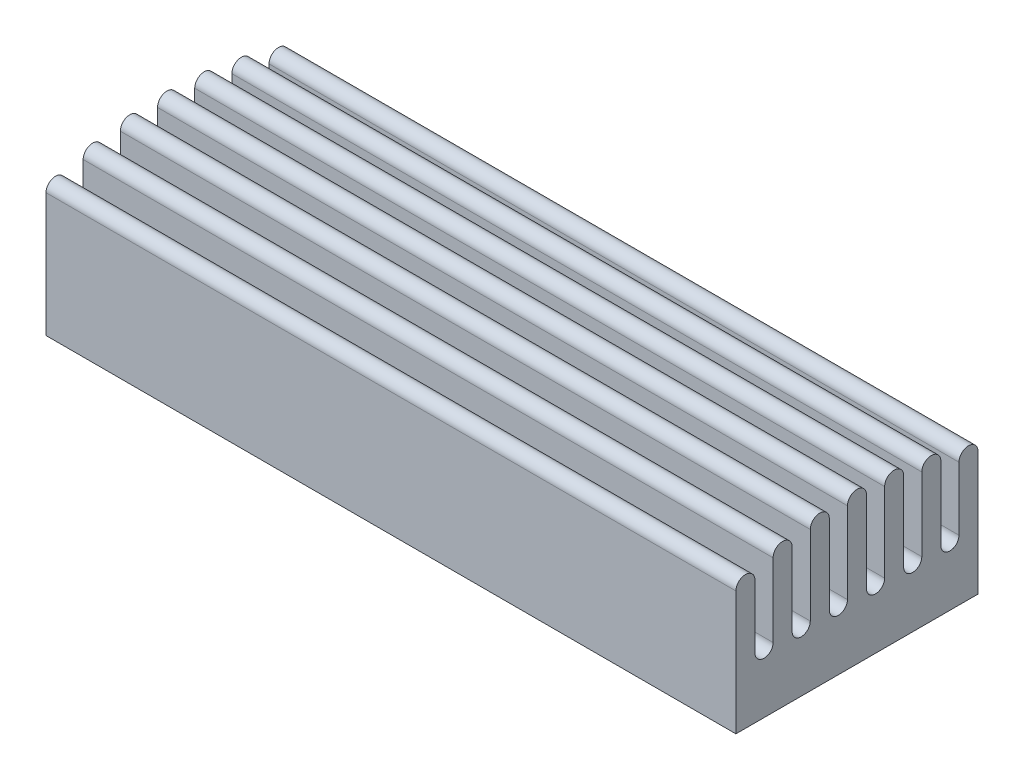
ISO-10303-21;
HEADER;
FILE_DESCRIPTION(('STEP AP214'),'2;1');
FILE_NAME('part.step','',(''),(''),'','','');
FILE_SCHEMA(('AUTOMOTIVE_DESIGN { 1 0 10303 214 1 1 1 1 }'));
ENDSEC;
DATA;
#1=APPLICATION_CONTEXT('core data for automotive mechanical design processes');
#2=APPLICATION_PROTOCOL_DEFINITION('international standard','automotive_design',2000,#1);
#3=PRODUCT_CONTEXT('',#1,'mechanical');
#4=PRODUCT('Part','Part','',(#3));
#5=PRODUCT_RELATED_PRODUCT_CATEGORY('part','',(#4));
#6=PRODUCT_DEFINITION_FORMATION('','',#4);
#7=PRODUCT_DEFINITION_CONTEXT('part definition',#1,'design');
#8=PRODUCT_DEFINITION('design','',#6,#7);
#9=PRODUCT_DEFINITION_SHAPE('','',#8);
#10=(LENGTH_UNIT() NAMED_UNIT(*) SI_UNIT(.MILLI.,.METRE.));
#11=(NAMED_UNIT(*) PLANE_ANGLE_UNIT() SI_UNIT($,.RADIAN.));
#12=(NAMED_UNIT(*) SI_UNIT($,.STERADIAN.) SOLID_ANGLE_UNIT());
#13=UNCERTAINTY_MEASURE_WITH_UNIT(LENGTH_MEASURE(1.E-05),#10,'distance_accuracy_value','');
#14=(GEOMETRIC_REPRESENTATION_CONTEXT(3) GLOBAL_UNCERTAINTY_ASSIGNED_CONTEXT((#13)) GLOBAL_UNIT_ASSIGNED_CONTEXT((#10,
#11,#12)) REPRESENTATION_CONTEXT('',''));
#15=CARTESIAN_POINT('',(0.,0.,0.));
#16=DIRECTION('',(0.,0.,1.));
#17=DIRECTION('',(1.,0.,0.));
#18=AXIS2_PLACEMENT_3D('',#15,#16,#17);
#19=CARTESIAN_POINT('',(28.5,12.5,-10.));
#20=DIRECTION('',(-1.,0.,0.));
#21=DIRECTION('',(0.,0.,1.));
#22=AXIS2_PLACEMENT_3D('',#19,#20,#21);
#23=PLANE('',#22);
#24=DIRECTION('',(0.,1.,0.));
#25=VECTOR('',#24,1.);
#26=CARTESIAN_POINT('',(28.5,5.,-0.785714285714294));
#27=LINE('',#26,#25);
#28=CARTESIAN_POINT('',(28.5,5.,-0.785714285714293));
#29=VERTEX_POINT('',#28);
#30=CARTESIAN_POINT('',(28.5,11.7142857142857,-0.785714285714294));
#31=VERTEX_POINT('',#30);
#32=EDGE_CURVE('E236',#29,#31,#27,.T.);
#33=ORIENTED_EDGE('',*,*,#32,.T.);
#34=CARTESIAN_POINT('',(28.5,11.7142857142857,0.));
#35=DIRECTION('',(-1.,0.,0.));
#36=DIRECTION('',(0.,0.,1.));
#37=AXIS2_PLACEMENT_3D('',#34,#35,#36);
#38=CIRCLE('',#37,0.785714285714284);
#39=CARTESIAN_POINT('',(28.5,11.7142857142857,0.785714285714294));
#40=VERTEX_POINT('',#39);
#41=EDGE_CURVE('E219',#40,#31,#38,.T.);
#42=ORIENTED_EDGE('',*,*,#41,.F.);
#43=DIRECTION('',(0.,1.,0.));
#44=VECTOR('',#43,1.);
#45=CARTESIAN_POINT('',(28.5,5.,0.785714285714294));
#46=LINE('',#45,#44);
#47=CARTESIAN_POINT('',(28.5,5.,0.785714285714293));
#48=VERTEX_POINT('',#47);
#49=EDGE_CURVE('E229',#48,#40,#46,.T.);
#50=ORIENTED_EDGE('',*,*,#49,.F.);
#51=CARTESIAN_POINT('',(28.5,5.,1.53571428571429));
#52=DIRECTION('',(1.,0.,0.));
#53=DIRECTION('',(0.,0.,-1.));
#54=AXIS2_PLACEMENT_3D('',#51,#52,#53);
#55=CIRCLE('',#54,0.75);
#56=CARTESIAN_POINT('',(28.5,5.,2.28571428571429));
#57=VERTEX_POINT('',#56);
#58=EDGE_CURVE('E361',#57,#48,#55,.T.);
#59=ORIENTED_EDGE('',*,*,#58,.F.);
#60=DIRECTION('',(0.,-1.,0.));
#61=VECTOR('',#60,1.);
#62=CARTESIAN_POINT('',(28.5,11.5523805621248,2.28571428571429));
#63=LINE('',#62,#61);
#64=CARTESIAN_POINT('',(28.5,11.5523805621248,2.28571428571429));
#65=VERTEX_POINT('',#64);
#66=EDGE_CURVE('E358',#65,#57,#63,.T.);
#67=ORIENTED_EDGE('',*,*,#66,.F.);
#68=CARTESIAN_POINT('',(28.5,11.5523805621248,3.07142857142858));
#69=DIRECTION('',(-1.,0.,0.));
#70=DIRECTION('',(0.,0.,1.));
#71=AXIS2_PLACEMENT_3D('',#68,#69,#70);
#72=CIRCLE('',#71,0.785714285714283);
#73=CARTESIAN_POINT('',(28.5,11.5523805621248,3.85714285714286));
#74=VERTEX_POINT('',#73);
#75=EDGE_CURVE('E355',#74,#65,#72,.T.);
#76=ORIENTED_EDGE('',*,*,#75,.F.);
#77=DIRECTION('',(0.,1.,0.));
#78=VECTOR('',#77,1.);
#79=CARTESIAN_POINT('',(28.5,5.,3.85714285714286));
#80=LINE('',#79,#78);
#81=CARTESIAN_POINT('',(28.5,5.,3.85714285714286));
#82=VERTEX_POINT('',#81);
#83=EDGE_CURVE('E352',#82,#74,#80,.T.);
#84=ORIENTED_EDGE('',*,*,#83,.F.);
#85=CARTESIAN_POINT('',(28.5,5.,4.60714285714286));
#86=DIRECTION('',(1.,0.,0.));
#87=DIRECTION('',(0.,0.,-1.));
#88=AXIS2_PLACEMENT_3D('',#85,#86,#87);
#89=CIRCLE('',#88,0.75);
#90=CARTESIAN_POINT('',(28.5,5.,5.35714285714286));
#91=VERTEX_POINT('',#90);
#92=EDGE_CURVE('E349',#91,#82,#89,.T.);
#93=ORIENTED_EDGE('',*,*,#92,.F.);
#94=DIRECTION('',(0.,-1.,0.));
#95=VECTOR('',#94,1.);
#96=CARTESIAN_POINT('',(28.5,11.0611588686167,5.35714285714286));
#97=LINE('',#96,#95);
#98=CARTESIAN_POINT('',(28.5,11.0611588686167,5.35714285714286));
#99=VERTEX_POINT('',#98);
#100=EDGE_CURVE('E346',#99,#91,#97,.T.);
#101=ORIENTED_EDGE('',*,*,#100,.F.);
#102=CARTESIAN_POINT('',(28.5,11.0611588686167,6.14285714285714));
#103=DIRECTION('',(-1.,0.,0.));
#104=DIRECTION('',(0.,0.,1.));
#105=AXIS2_PLACEMENT_3D('',#102,#103,#104);
#106=CIRCLE('',#105,0.785714285714284);
#107=CARTESIAN_POINT('',(28.5,11.0611588686167,6.92857142857143));
#108=VERTEX_POINT('',#107);
#109=EDGE_CURVE('E343',#108,#99,#106,.T.);
#110=ORIENTED_EDGE('',*,*,#109,.F.);
#111=DIRECTION('',(0.,1.,0.));
#112=VECTOR('',#111,1.);
#113=CARTESIAN_POINT('',(28.5,5.,6.92857142857143));
#114=LINE('',#113,#112);
#115=CARTESIAN_POINT('',(28.5,5.,6.92857142857143));
#116=VERTEX_POINT('',#115);
#117=EDGE_CURVE('E340',#116,#108,#114,.T.);
#118=ORIENTED_EDGE('',*,*,#117,.F.);
#119=CARTESIAN_POINT('',(28.5,5.,7.67857142857143));
#120=DIRECTION('',(1.,0.,0.));
#121=DIRECTION('',(0.,0.,-1.));
#122=AXIS2_PLACEMENT_3D('',#119,#120,#121);
#123=CIRCLE('',#122,0.750000000000001);
#124=CARTESIAN_POINT('',(28.5,5.,8.42857142857143));
#125=VERTEX_POINT('',#124);
#126=EDGE_CURVE('E337',#125,#116,#123,.T.);
#127=ORIENTED_EDGE('',*,*,#126,.F.);
#128=DIRECTION('',(0.,-1.,0.));
#129=VECTOR('',#128,1.);
#130=CARTESIAN_POINT('',(28.5,10.2231208303002,8.42857142857143));
#131=LINE('',#130,#129);
#132=CARTESIAN_POINT('',(28.5,10.2231208303002,8.42857142857143));
#133=VERTEX_POINT('',#132);
#134=EDGE_CURVE('E334',#133,#125,#131,.T.);
#135=ORIENTED_EDGE('',*,*,#134,.F.);
#136=CARTESIAN_POINT('',(28.5,10.2231208303002,9.21428571428571));
#137=DIRECTION('',(-1.,0.,0.));
#138=DIRECTION('',(0.,0.,1.));
#139=AXIS2_PLACEMENT_3D('',#136,#137,#138);
#140=CIRCLE('',#139,0.785714285714282);
#141=CARTESIAN_POINT('',(28.5,10.2231208303002,9.99999999999999));
#142=VERTEX_POINT('',#141);
#143=EDGE_CURVE('E331',#142,#133,#140,.T.);
#144=ORIENTED_EDGE('',*,*,#143,.F.);
#145=DIRECTION('',(0.,-1.,0.));
#146=VECTOR('',#145,1.);
#147=CARTESIAN_POINT('',(28.5,12.5,9.99999999999999));
#148=LINE('',#147,#146);
#149=CARTESIAN_POINT('',(28.5,0.,9.99999999999999));
#150=VERTEX_POINT('',#149);
#151=EDGE_CURVE('E47',#142,#150,#148,.T.);
#152=ORIENTED_EDGE('',*,*,#151,.T.);
#153=DIRECTION('',(0.,0.,-1.));
#154=VECTOR('',#153,1.);
#155=CARTESIAN_POINT('',(28.5,0.,-10.));
#156=LINE('',#155,#154);
#157=CARTESIAN_POINT('',(28.5,0.,-10.));
#158=VERTEX_POINT('',#157);
#159=EDGE_CURVE('E330',#150,#158,#156,.T.);
#160=ORIENTED_EDGE('',*,*,#159,.T.);
#161=DIRECTION('',(0.,-1.,0.));
#162=VECTOR('',#161,1.);
#163=CARTESIAN_POINT('',(28.5,12.5,-10.));
#164=LINE('',#163,#162);
#165=CARTESIAN_POINT('',(28.5,10.2231208303002,-9.99999999999999));
#166=VERTEX_POINT('',#165);
#167=EDGE_CURVE('E11',#166,#158,#164,.T.);
#168=ORIENTED_EDGE('',*,*,#167,.F.);
#169=CARTESIAN_POINT('',(28.5,10.2231208303002,-9.21428571428571));
#170=DIRECTION('',(1.,0.,0.));
#171=DIRECTION('',(0.,0.,-1.));
#172=AXIS2_PLACEMENT_3D('',#169,#170,#171);
#173=CIRCLE('',#172,0.785714285714282);
#174=CARTESIAN_POINT('',(28.5,10.2231208303002,-8.42857142857143));
#175=VERTEX_POINT('',#174);
#176=EDGE_CURVE('E241',#166,#175,#173,.T.);
#177=ORIENTED_EDGE('',*,*,#176,.T.);
#178=DIRECTION('',(0.,-1.,0.));
#179=VECTOR('',#178,1.);
#180=CARTESIAN_POINT('',(28.5,10.2231208303002,-8.42857142857143));
#181=LINE('',#180,#179);
#182=CARTESIAN_POINT('',(28.5,5.,-8.42857142857143));
#183=VERTEX_POINT('',#182);
#184=EDGE_CURVE('E275',#175,#183,#181,.T.);
#185=ORIENTED_EDGE('',*,*,#184,.T.);
#186=CARTESIAN_POINT('',(28.5,5.,-7.67857142857143));
#187=DIRECTION('',(-1.,0.,0.));
#188=DIRECTION('',(0.,0.,1.));
#189=AXIS2_PLACEMENT_3D('',#186,#187,#188);
#190=CIRCLE('',#189,0.750000000000001);
#191=CARTESIAN_POINT('',(28.5,5.,-6.92857142857143));
#192=VERTEX_POINT('',#191);
#193=EDGE_CURVE('E272',#183,#192,#190,.T.);
#194=ORIENTED_EDGE('',*,*,#193,.T.);
#195=DIRECTION('',(0.,1.,0.));
#196=VECTOR('',#195,1.);
#197=CARTESIAN_POINT('',(28.5,5.,-6.92857142857143));
#198=LINE('',#197,#196);
#199=CARTESIAN_POINT('',(28.5,11.0611588686167,-6.92857142857143));
#200=VERTEX_POINT('',#199);
#201=EDGE_CURVE('E269',#192,#200,#198,.T.);
#202=ORIENTED_EDGE('',*,*,#201,.T.);
#203=CARTESIAN_POINT('',(28.5,11.0611588686167,-6.14285714285714));
#204=DIRECTION('',(1.,0.,0.));
#205=DIRECTION('',(0.,0.,-1.));
#206=AXIS2_PLACEMENT_3D('',#203,#204,#205);
#207=CIRCLE('',#206,0.785714285714284);
#208=CARTESIAN_POINT('',(28.5,11.0611588686167,-5.35714285714286));
#209=VERTEX_POINT('',#208);
#210=EDGE_CURVE('E266',#200,#209,#207,.T.);
#211=ORIENTED_EDGE('',*,*,#210,.T.);
#212=DIRECTION('',(0.,-1.,0.));
#213=VECTOR('',#212,1.);
#214=CARTESIAN_POINT('',(28.5,11.0611588686167,-5.35714285714286));
#215=LINE('',#214,#213);
#216=CARTESIAN_POINT('',(28.5,5.,-5.35714285714286));
#217=VERTEX_POINT('',#216);
#218=EDGE_CURVE('E263',#209,#217,#215,.T.);
#219=ORIENTED_EDGE('',*,*,#218,.T.);
#220=CARTESIAN_POINT('',(28.5,5.,-4.60714285714286));
#221=DIRECTION('',(-1.,0.,0.));
#222=DIRECTION('',(0.,0.,1.));
#223=AXIS2_PLACEMENT_3D('',#220,#221,#222);
#224=CIRCLE('',#223,0.75);
#225=CARTESIAN_POINT('',(28.5,5.,-3.85714285714286));
#226=VERTEX_POINT('',#225);
#227=EDGE_CURVE('E260',#217,#226,#224,.T.);
#228=ORIENTED_EDGE('',*,*,#227,.T.);
#229=DIRECTION('',(0.,1.,0.));
#230=VECTOR('',#229,1.);
#231=CARTESIAN_POINT('',(28.5,5.,-3.85714285714286));
#232=LINE('',#231,#230);
#233=CARTESIAN_POINT('',(28.5,11.5523805621248,-3.85714285714286));
#234=VERTEX_POINT('',#233);
#235=EDGE_CURVE('E257',#226,#234,#232,.T.);
#236=ORIENTED_EDGE('',*,*,#235,.T.);
#237=CARTESIAN_POINT('',(28.5,11.5523805621248,-3.07142857142858));
#238=DIRECTION('',(1.,0.,0.));
#239=DIRECTION('',(0.,0.,-1.));
#240=AXIS2_PLACEMENT_3D('',#237,#238,#239);
#241=CIRCLE('',#240,0.785714285714283);
#242=CARTESIAN_POINT('',(28.5,11.5523805621248,-2.28571428571429));
#243=VERTEX_POINT('',#242);
#244=EDGE_CURVE('E254',#234,#243,#241,.T.);
#245=ORIENTED_EDGE('',*,*,#244,.T.);
#246=DIRECTION('',(0.,-1.,0.));
#247=VECTOR('',#246,1.);
#248=CARTESIAN_POINT('',(28.5,11.5523805621248,-2.28571428571429));
#249=LINE('',#248,#247);
#250=CARTESIAN_POINT('',(28.5,5.,-2.28571428571429));
#251=VERTEX_POINT('',#250);
#252=EDGE_CURVE('E247',#243,#251,#249,.T.);
#253=ORIENTED_EDGE('',*,*,#252,.T.);
#254=CARTESIAN_POINT('',(28.5,5.,-1.53571428571429));
#255=DIRECTION('',(-1.,0.,0.));
#256=DIRECTION('',(0.,0.,1.));
#257=AXIS2_PLACEMENT_3D('',#254,#255,#256);
#258=CIRCLE('',#257,0.75);
#259=EDGE_CURVE('E245',#251,#29,#258,.T.);
#260=ORIENTED_EDGE('',*,*,#259,.T.);
#261=EDGE_LOOP('',(#33,#42,#50,#59,#67,#76,#84,#93,#101,#110,#118,#127,#135,#144,#152,#160,#168,
#177,#185,#194,#202,#211,#219,#228,#236,#245,#253,#260));
#262=FACE_BOUND('',#261,.T.);
#263=ADVANCED_FACE('F33',(#262),#23,.F.);
#264=CARTESIAN_POINT('',(-28.5,12.5,-10.));
#265=DIRECTION('',(1.,0.,0.));
#266=DIRECTION('',(0.,0.,-1.));
#267=AXIS2_PLACEMENT_3D('',#264,#265,#266);
#268=PLANE('',#267);
#269=CARTESIAN_POINT('',(-28.5,11.7142857142857,0.));
#270=DIRECTION('',(1.,0.,0.));
#271=DIRECTION('',(0.,0.,-1.));
#272=AXIS2_PLACEMENT_3D('',#269,#270,#271);
#273=CIRCLE('',#272,0.785714285714284);
#274=CARTESIAN_POINT('',(-28.5,11.7142857142857,-0.785714285714274));
#275=VERTEX_POINT('',#274);
#276=CARTESIAN_POINT('',(-28.5,11.7142857142857,0.785714285714274));
#277=VERTEX_POINT('',#276);
#278=EDGE_CURVE('E328',#275,#277,#273,.T.);
#279=ORIENTED_EDGE('',*,*,#278,.F.);
#280=DIRECTION('',(0.,-1.,0.));
#281=VECTOR('',#280,1.);
#282=CARTESIAN_POINT('',(-28.5,5.,-0.785714285714274));
#283=LINE('',#282,#281);
#284=CARTESIAN_POINT('',(-28.5,5.,-0.785714285714274));
#285=VERTEX_POINT('',#284);
#286=EDGE_CURVE('E239',#275,#285,#283,.T.);
#287=ORIENTED_EDGE('',*,*,#286,.T.);
#288=CARTESIAN_POINT('',(-28.5,5.,-1.53571428571427));
#289=DIRECTION('',(1.,0.,0.));
#290=DIRECTION('',(0.,0.,-1.));
#291=AXIS2_PLACEMENT_3D('',#288,#289,#290);
#292=CIRCLE('',#291,0.75);
#293=CARTESIAN_POINT('',(-28.5,5.,-2.28571428571427));
#294=VERTEX_POINT('',#293);
#295=EDGE_CURVE('E472',#285,#294,#292,.T.);
#296=ORIENTED_EDGE('',*,*,#295,.T.);
#297=DIRECTION('',(0.,1.,0.));
#298=VECTOR('',#297,1.);
#299=CARTESIAN_POINT('',(-28.5,11.5523805621248,-2.28571428571427));
#300=LINE('',#299,#298);
#301=CARTESIAN_POINT('',(-28.5,11.5523805621248,-2.28571428571427));
#302=VERTEX_POINT('',#301);
#303=EDGE_CURVE('E474',#294,#302,#300,.T.);
#304=ORIENTED_EDGE('',*,*,#303,.T.);
#305=CARTESIAN_POINT('',(-28.5,11.5523805621248,-3.07142857142856));
#306=DIRECTION('',(1.,0.,0.));
#307=DIRECTION('',(0.,0.,-1.));
#308=AXIS2_PLACEMENT_3D('',#305,#306,#307);
#309=CIRCLE('',#308,0.785714285714283);
#310=CARTESIAN_POINT('',(-28.5,11.5523805621248,-3.85714285714284));
#311=VERTEX_POINT('',#310);
#312=EDGE_CURVE('E478',#302,#311,#309,.F.);
#313=ORIENTED_EDGE('',*,*,#312,.T.);
#314=DIRECTION('',(0.,-1.,0.));
#315=VECTOR('',#314,1.);
#316=CARTESIAN_POINT('',(-28.5,5.,-3.85714285714284));
#317=LINE('',#316,#315);
#318=CARTESIAN_POINT('',(-28.5,5.,-3.85714285714284));
#319=VERTEX_POINT('',#318);
#320=EDGE_CURVE('E481',#311,#319,#317,.T.);
#321=ORIENTED_EDGE('',*,*,#320,.T.);
#322=CARTESIAN_POINT('',(-28.5,5.,-4.60714285714284));
#323=DIRECTION('',(1.,0.,0.));
#324=DIRECTION('',(0.,0.,-1.));
#325=AXIS2_PLACEMENT_3D('',#322,#323,#324);
#326=CIRCLE('',#325,0.75);
#327=CARTESIAN_POINT('',(-28.5,5.,-5.35714285714284));
#328=VERTEX_POINT('',#327);
#329=EDGE_CURVE('E484',#319,#328,#326,.T.);
#330=ORIENTED_EDGE('',*,*,#329,.T.);
#331=DIRECTION('',(0.,1.,0.));
#332=VECTOR('',#331,1.);
#333=CARTESIAN_POINT('',(-28.5,11.0611588686167,-5.35714285714284));
#334=LINE('',#333,#332);
#335=CARTESIAN_POINT('',(-28.5,11.0611588686167,-5.35714285714284));
#336=VERTEX_POINT('',#335);
#337=EDGE_CURVE('E487',#328,#336,#334,.T.);
#338=ORIENTED_EDGE('',*,*,#337,.T.);
#339=CARTESIAN_POINT('',(-28.5,11.0611588686167,-6.14285714285712));
#340=DIRECTION('',(1.,0.,0.));
#341=DIRECTION('',(0.,0.,-1.));
#342=AXIS2_PLACEMENT_3D('',#339,#340,#341);
#343=CIRCLE('',#342,0.785714285714284);
#344=CARTESIAN_POINT('',(-28.5,11.0611588686167,-6.92857142857141));
#345=VERTEX_POINT('',#344);
#346=EDGE_CURVE('E490',#336,#345,#343,.F.);
#347=ORIENTED_EDGE('',*,*,#346,.T.);
#348=DIRECTION('',(0.,-1.,0.));
#349=VECTOR('',#348,1.);
#350=CARTESIAN_POINT('',(-28.5,5.,-6.92857142857141));
#351=LINE('',#350,#349);
#352=CARTESIAN_POINT('',(-28.5,5.,-6.92857142857141));
#353=VERTEX_POINT('',#352);
#354=EDGE_CURVE('E493',#345,#353,#351,.T.);
#355=ORIENTED_EDGE('',*,*,#354,.T.);
#356=CARTESIAN_POINT('',(-28.5,5.,-7.67857142857141));
#357=DIRECTION('',(1.,0.,0.));
#358=DIRECTION('',(0.,0.,-1.));
#359=AXIS2_PLACEMENT_3D('',#356,#357,#358);
#360=CIRCLE('',#359,0.750000000000001);
#361=CARTESIAN_POINT('',(-28.5,5.,-8.42857142857141));
#362=VERTEX_POINT('',#361);
#363=EDGE_CURVE('E496',#353,#362,#360,.T.);
#364=ORIENTED_EDGE('',*,*,#363,.T.);
#365=DIRECTION('',(0.,1.,0.));
#366=VECTOR('',#365,1.);
#367=CARTESIAN_POINT('',(-28.5,10.2231208303002,-8.42857142857141));
#368=LINE('',#367,#366);
#369=CARTESIAN_POINT('',(-28.5,10.2231208303002,-8.42857142857141));
#370=VERTEX_POINT('',#369);
#371=EDGE_CURVE('E498',#362,#370,#368,.T.);
#372=ORIENTED_EDGE('',*,*,#371,.T.);
#373=CARTESIAN_POINT('',(-28.5,10.2231208303002,-9.21428571428569));
#374=DIRECTION('',(1.,0.,0.));
#375=DIRECTION('',(0.,0.,-1.));
#376=AXIS2_PLACEMENT_3D('',#373,#374,#375);
#377=CIRCLE('',#376,0.785714285714282);
#378=CARTESIAN_POINT('',(-28.5,10.2231208303002,-9.99999999999998));
#379=VERTEX_POINT('',#378);
#380=EDGE_CURVE('E250',#370,#379,#377,.F.);
#381=ORIENTED_EDGE('',*,*,#380,.T.);
#382=DIRECTION('',(0.,-1.,0.));
#383=VECTOR('',#382,1.);
#384=CARTESIAN_POINT('',(-28.5,12.5,-10.));
#385=LINE('',#384,#383);
#386=CARTESIAN_POINT('',(-28.5,0.,-10.));
#387=VERTEX_POINT('',#386);
#388=EDGE_CURVE('E40',#379,#387,#385,.T.);
#389=ORIENTED_EDGE('',*,*,#388,.T.);
#390=DIRECTION('',(0.,0.,1.));
#391=VECTOR('',#390,1.);
#392=CARTESIAN_POINT('',(-28.5,0.,-10.));
#393=LINE('',#392,#391);
#394=CARTESIAN_POINT('',(-28.5,0.,9.99999999999999));
#395=VERTEX_POINT('',#394);
#396=EDGE_CURVE('E393',#387,#395,#393,.T.);
#397=ORIENTED_EDGE('',*,*,#396,.T.);
#398=DIRECTION('',(0.,-1.,0.));
#399=VECTOR('',#398,1.);
#400=CARTESIAN_POINT('',(-28.5,12.5,9.99999999999999));
#401=LINE('',#400,#399);
#402=CARTESIAN_POINT('',(-28.5,10.2231208303002,9.99999999999998));
#403=VERTEX_POINT('',#402);
#404=EDGE_CURVE('E54',#403,#395,#401,.T.);
#405=ORIENTED_EDGE('',*,*,#404,.F.);
#406=CARTESIAN_POINT('',(-28.5,10.2231208303002,9.21428571428569));
#407=DIRECTION('',(1.,0.,0.));
#408=DIRECTION('',(0.,0.,-1.));
#409=AXIS2_PLACEMENT_3D('',#406,#407,#408);
#410=CIRCLE('',#409,0.785714285714282);
#411=CARTESIAN_POINT('',(-28.5,10.2231208303002,8.42857142857141));
#412=VERTEX_POINT('',#411);
#413=EDGE_CURVE('E304',#412,#403,#410,.T.);
#414=ORIENTED_EDGE('',*,*,#413,.F.);
#415=DIRECTION('',(0.,1.,0.));
#416=VECTOR('',#415,1.);
#417=CARTESIAN_POINT('',(-28.5,10.2231208303002,8.42857142857141));
#418=LINE('',#417,#416);
#419=CARTESIAN_POINT('',(-28.5,5.,8.42857142857141));
#420=VERTEX_POINT('',#419);
#421=EDGE_CURVE('E306',#420,#412,#418,.T.);
#422=ORIENTED_EDGE('',*,*,#421,.F.);
#423=CARTESIAN_POINT('',(-28.5,5.,7.67857142857141));
#424=DIRECTION('',(1.,0.,0.));
#425=DIRECTION('',(0.,0.,-1.));
#426=AXIS2_PLACEMENT_3D('',#423,#424,#425);
#427=CIRCLE('',#426,0.750000000000001);
#428=CARTESIAN_POINT('',(-28.5,5.,6.92857142857141));
#429=VERTEX_POINT('',#428);
#430=EDGE_CURVE('E308',#429,#420,#427,.F.);
#431=ORIENTED_EDGE('',*,*,#430,.F.);
#432=DIRECTION('',(0.,-1.,0.));
#433=VECTOR('',#432,1.);
#434=CARTESIAN_POINT('',(-28.5,5.,6.92857142857141));
#435=LINE('',#434,#433);
#436=CARTESIAN_POINT('',(-28.5,11.0611588686167,6.92857142857141));
#437=VERTEX_POINT('',#436);
#438=EDGE_CURVE('E310',#437,#429,#435,.T.);
#439=ORIENTED_EDGE('',*,*,#438,.F.);
#440=CARTESIAN_POINT('',(-28.5,11.0611588686167,6.14285714285712));
#441=DIRECTION('',(1.,0.,0.));
#442=DIRECTION('',(0.,0.,-1.));
#443=AXIS2_PLACEMENT_3D('',#440,#441,#442);
#444=CIRCLE('',#443,0.785714285714284);
#445=CARTESIAN_POINT('',(-28.5,11.0611588686167,5.35714285714284));
#446=VERTEX_POINT('',#445);
#447=EDGE_CURVE('E312',#446,#437,#444,.T.);
#448=ORIENTED_EDGE('',*,*,#447,.F.);
#449=DIRECTION('',(0.,1.,0.));
#450=VECTOR('',#449,1.);
#451=CARTESIAN_POINT('',(-28.5,11.0611588686167,5.35714285714284));
#452=LINE('',#451,#450);
#453=CARTESIAN_POINT('',(-28.5,5.,5.35714285714284));
#454=VERTEX_POINT('',#453);
#455=EDGE_CURVE('E314',#454,#446,#452,.T.);
#456=ORIENTED_EDGE('',*,*,#455,.F.);
#457=CARTESIAN_POINT('',(-28.5,5.,4.60714285714284));
#458=DIRECTION('',(1.,0.,0.));
#459=DIRECTION('',(0.,0.,-1.));
#460=AXIS2_PLACEMENT_3D('',#457,#458,#459);
#461=CIRCLE('',#460,0.75);
#462=CARTESIAN_POINT('',(-28.5,5.,3.85714285714284));
#463=VERTEX_POINT('',#462);
#464=EDGE_CURVE('E316',#463,#454,#461,.F.);
#465=ORIENTED_EDGE('',*,*,#464,.F.);
#466=DIRECTION('',(0.,-1.,0.));
#467=VECTOR('',#466,1.);
#468=CARTESIAN_POINT('',(-28.5,5.,3.85714285714284));
#469=LINE('',#468,#467);
#470=CARTESIAN_POINT('',(-28.5,11.5523805621248,3.85714285714284));
#471=VERTEX_POINT('',#470);
#472=EDGE_CURVE('E318',#471,#463,#469,.T.);
#473=ORIENTED_EDGE('',*,*,#472,.F.);
#474=CARTESIAN_POINT('',(-28.5,11.5523805621248,3.07142857142856));
#475=DIRECTION('',(1.,0.,0.));
#476=DIRECTION('',(0.,0.,-1.));
#477=AXIS2_PLACEMENT_3D('',#474,#475,#476);
#478=CIRCLE('',#477,0.785714285714283);
#479=CARTESIAN_POINT('',(-28.5,11.5523805621248,2.28571428571427));
#480=VERTEX_POINT('',#479);
#481=EDGE_CURVE('E320',#480,#471,#478,.T.);
#482=ORIENTED_EDGE('',*,*,#481,.F.);
#483=DIRECTION('',(0.,1.,0.));
#484=VECTOR('',#483,1.);
#485=CARTESIAN_POINT('',(-28.5,11.5523805621248,2.28571428571427));
#486=LINE('',#485,#484);
#487=CARTESIAN_POINT('',(-28.5,5.,2.28571428571427));
#488=VERTEX_POINT('',#487);
#489=EDGE_CURVE('E322',#488,#480,#486,.T.);
#490=ORIENTED_EDGE('',*,*,#489,.F.);
#491=CARTESIAN_POINT('',(-28.5,5.,1.53571428571427));
#492=DIRECTION('',(1.,0.,0.));
#493=DIRECTION('',(0.,0.,-1.));
#494=AXIS2_PLACEMENT_3D('',#491,#492,#493);
#495=CIRCLE('',#494,0.75);
#496=CARTESIAN_POINT('',(-28.5,5.,0.785714285714274));
#497=VERTEX_POINT('',#496);
#498=EDGE_CURVE('E324',#497,#488,#495,.F.);
#499=ORIENTED_EDGE('',*,*,#498,.F.);
#500=DIRECTION('',(0.,-1.,0.));
#501=VECTOR('',#500,1.);
#502=CARTESIAN_POINT('',(-28.5,5.,0.785714285714274));
#503=LINE('',#502,#501);
#504=EDGE_CURVE('E326',#277,#497,#503,.T.);
#505=ORIENTED_EDGE('',*,*,#504,.F.);
#506=EDGE_LOOP('',(#279,#287,#296,#304,#313,#321,#330,#338,#347,#355,#364,#372,#381,#389,#397,
#405,#414,#422,#431,#439,#448,#456,#465,#473,#482,#490,#499,#505));
#507=FACE_BOUND('',#506,.T.);
#508=ADVANCED_FACE('F401',(#507),#268,.F.);
#509=CARTESIAN_POINT('',(-28.5,12.5,-10.));
#510=DIRECTION('',(0.,0.,1.));
#511=DIRECTION('',(1.,0.,0.));
#512=AXIS2_PLACEMENT_3D('',#509,#510,#511);
#513=PLANE('',#512);
#514=ORIENTED_EDGE('',*,*,#388,.F.);
#515=DIRECTION('',(1.,0.,0.));
#516=VECTOR('',#515,1.);
#517=CARTESIAN_POINT('',(-41.4638921624642,10.2231208303002,-9.99999999999997));
#518=LINE('',#517,#516);
#519=EDGE_CURVE('E280',#379,#166,#518,.T.);
#520=ORIENTED_EDGE('',*,*,#519,.T.);
#521=ORIENTED_EDGE('',*,*,#167,.T.);
#522=DIRECTION('',(-1.,0.,0.));
#523=VECTOR('',#522,1.);
#524=CARTESIAN_POINT('',(-28.5,0.,-10.));
#525=LINE('',#524,#523);
#526=EDGE_CURVE('E390',#158,#387,#525,.T.);
#527=ORIENTED_EDGE('',*,*,#526,.T.);
#528=EDGE_LOOP('',(#514,#520,#521,#527));
#529=FACE_BOUND('',#528,.T.);
#530=ADVANCED_FACE('F407',(#529),#513,.F.);
#531=CARTESIAN_POINT('',(-28.5,12.5,9.99999999999999));
#532=DIRECTION('',(0.,0.,-1.));
#533=DIRECTION('',(-1.,0.,0.));
#534=AXIS2_PLACEMENT_3D('',#531,#532,#533);
#535=PLANE('',#534);
#536=ORIENTED_EDGE('',*,*,#151,.F.);
#537=DIRECTION('',(1.,0.,0.));
#538=VECTOR('',#537,1.);
#539=CARTESIAN_POINT('',(-41.4638921624642,10.2231208303002,9.99999999999997));
#540=LINE('',#539,#538);
#541=EDGE_CURVE('E228',#403,#142,#540,.T.);
#542=ORIENTED_EDGE('',*,*,#541,.F.);
#543=ORIENTED_EDGE('',*,*,#404,.T.);
#544=DIRECTION('',(1.,0.,0.));
#545=VECTOR('',#544,1.);
#546=CARTESIAN_POINT('',(-28.5,0.,9.99999999999999));
#547=LINE('',#546,#545);
#548=EDGE_CURVE('E395',#395,#150,#547,.T.);
#549=ORIENTED_EDGE('',*,*,#548,.T.);
#550=EDGE_LOOP('',(#536,#542,#543,#549));
#551=FACE_BOUND('',#550,.T.);
#552=ADVANCED_FACE('F412',(#551),#535,.F.);
#553=CARTESIAN_POINT('',(0.,0.,0.));
#554=DIRECTION('',(0.,1.,0.));
#555=DIRECTION('',(0.,0.,1.));
#556=AXIS2_PLACEMENT_3D('',#553,#554,#555);
#557=PLANE('',#556);
#558=ORIENTED_EDGE('',*,*,#159,.F.);
#559=ORIENTED_EDGE('',*,*,#548,.F.);
#560=ORIENTED_EDGE('',*,*,#396,.F.);
#561=ORIENTED_EDGE('',*,*,#526,.F.);
#562=EDGE_LOOP('',(#558,#559,#560,#561));
#563=FACE_BOUND('',#562,.T.);
#564=ADVANCED_FACE('F411',(#563),#557,.F.);
#565=CARTESIAN_POINT('',(-41.4638921624642,11.7142857142857,0.));
#566=DIRECTION('',(1.,0.,0.));
#567=DIRECTION('',(0.,0.,-1.));
#568=AXIS2_PLACEMENT_3D('',#565,#566,#567);
#569=CYLINDRICAL_SURFACE('',#568,0.785714285714284);
#570=ORIENTED_EDGE('',*,*,#278,.T.);
#571=DIRECTION('',(1.,0.,0.));
#572=VECTOR('',#571,1.);
#573=CARTESIAN_POINT('',(-41.4638921624642,11.7142857142857,0.785714285714269));
#574=LINE('',#573,#572);
#575=EDGE_CURVE('E224',#277,#40,#574,.T.);
#576=ORIENTED_EDGE('',*,*,#575,.T.);
#577=ORIENTED_EDGE('',*,*,#41,.T.);
#578=DIRECTION('',(1.,0.,0.));
#579=VECTOR('',#578,1.);
#580=CARTESIAN_POINT('',(-41.4638921624642,11.7142857142857,-0.785714285714269));
#581=LINE('',#580,#579);
#582=EDGE_CURVE('E222',#275,#31,#581,.T.);
#583=ORIENTED_EDGE('',*,*,#582,.F.);
#584=EDGE_LOOP('',(#570,#576,#577,#583));
#585=FACE_BOUND('',#584,.T.);
#586=ADVANCED_FACE('F221',(#585),#569,.T.);
#587=CARTESIAN_POINT('',(-41.4638921624642,5.,0.785714285714269));
#588=DIRECTION('',(0.,0.,-1.));
#589=DIRECTION('',(-1.,0.,0.));
#590=AXIS2_PLACEMENT_3D('',#587,#588,#589);
#591=PLANE('',#590);
#592=ORIENTED_EDGE('',*,*,#504,.T.);
#593=DIRECTION('',(1.,0.,0.));
#594=VECTOR('',#593,1.);
#595=CARTESIAN_POINT('',(-41.4638921624642,5.,0.785714285714269));
#596=LINE('',#595,#594);
#597=EDGE_CURVE('E366',#497,#48,#596,.T.);
#598=ORIENTED_EDGE('',*,*,#597,.T.);
#599=ORIENTED_EDGE('',*,*,#49,.T.);
#600=ORIENTED_EDGE('',*,*,#575,.F.);
#601=EDGE_LOOP('',(#592,#598,#599,#600));
#602=FACE_BOUND('',#601,.T.);
#603=ADVANCED_FACE('F469',(#602),#591,.F.);
#604=CARTESIAN_POINT('',(-41.4638921624642,5.,1.53571428571427));
#605=DIRECTION('',(1.,0.,0.));
#606=DIRECTION('',(0.,0.,-1.));
#607=AXIS2_PLACEMENT_3D('',#604,#605,#606);
#608=CYLINDRICAL_SURFACE('',#607,0.75);
#609=ORIENTED_EDGE('',*,*,#498,.T.);
#610=DIRECTION('',(1.,0.,0.));
#611=VECTOR('',#610,1.);
#612=CARTESIAN_POINT('',(-41.4638921624642,5.,2.28571428571427));
#613=LINE('',#612,#611);
#614=EDGE_CURVE('E368',#488,#57,#613,.T.);
#615=ORIENTED_EDGE('',*,*,#614,.T.);
#616=ORIENTED_EDGE('',*,*,#58,.T.);
#617=ORIENTED_EDGE('',*,*,#597,.F.);
#618=EDGE_LOOP('',(#609,#615,#616,#617));
#619=FACE_BOUND('',#618,.T.);
#620=ADVANCED_FACE('F466',(#619),#608,.F.);
#621=CARTESIAN_POINT('',(-41.4638921624642,11.5523805621248,2.28571428571427));
#622=DIRECTION('',(0.,0.,1.));
#623=DIRECTION('',(1.,0.,0.));
#624=AXIS2_PLACEMENT_3D('',#621,#622,#623);
#625=PLANE('',#624);
#626=ORIENTED_EDGE('',*,*,#489,.T.);
#627=DIRECTION('',(1.,0.,0.));
#628=VECTOR('',#627,1.);
#629=CARTESIAN_POINT('',(-41.4638921624642,11.5523805621248,2.28571428571427));
#630=LINE('',#629,#628);
#631=EDGE_CURVE('E370',#480,#65,#630,.T.);
#632=ORIENTED_EDGE('',*,*,#631,.T.);
#633=ORIENTED_EDGE('',*,*,#66,.T.);
#634=ORIENTED_EDGE('',*,*,#614,.F.);
#635=EDGE_LOOP('',(#626,#632,#633,#634));
#636=FACE_BOUND('',#635,.T.);
#637=ADVANCED_FACE('F463',(#636),#625,.F.);
#638=CARTESIAN_POINT('',(-41.4638921624642,11.5523805621248,3.07142857142855));
#639=DIRECTION('',(1.,0.,0.));
#640=DIRECTION('',(0.,0.,-1.));
#641=AXIS2_PLACEMENT_3D('',#638,#639,#640);
#642=CYLINDRICAL_SURFACE('',#641,0.785714285714283);
#643=ORIENTED_EDGE('',*,*,#481,.T.);
#644=DIRECTION('',(1.,0.,0.));
#645=VECTOR('',#644,1.);
#646=CARTESIAN_POINT('',(-41.4638921624642,11.5523805621248,3.85714285714284));
#647=LINE('',#646,#645);
#648=EDGE_CURVE('E372',#471,#74,#647,.T.);
#649=ORIENTED_EDGE('',*,*,#648,.T.);
#650=ORIENTED_EDGE('',*,*,#75,.T.);
#651=ORIENTED_EDGE('',*,*,#631,.F.);
#652=EDGE_LOOP('',(#643,#649,#650,#651));
#653=FACE_BOUND('',#652,.T.);
#654=ADVANCED_FACE('F455',(#653),#642,.T.);
#655=CARTESIAN_POINT('',(-41.4638921624642,5.,3.85714285714284));
#656=DIRECTION('',(0.,0.,-1.));
#657=DIRECTION('',(-1.,0.,0.));
#658=AXIS2_PLACEMENT_3D('',#655,#656,#657);
#659=PLANE('',#658);
#660=ORIENTED_EDGE('',*,*,#472,.T.);
#661=DIRECTION('',(1.,0.,0.));
#662=VECTOR('',#661,1.);
#663=CARTESIAN_POINT('',(-41.4638921624642,5.,3.85714285714284));
#664=LINE('',#663,#662);
#665=EDGE_CURVE('E374',#463,#82,#664,.T.);
#666=ORIENTED_EDGE('',*,*,#665,.T.);
#667=ORIENTED_EDGE('',*,*,#83,.T.);
#668=ORIENTED_EDGE('',*,*,#648,.F.);
#669=EDGE_LOOP('',(#660,#666,#667,#668));
#670=FACE_BOUND('',#669,.T.);
#671=ADVANCED_FACE('F451',(#670),#659,.F.);
#672=CARTESIAN_POINT('',(-41.4638921624642,5.,4.60714285714284));
#673=DIRECTION('',(1.,0.,0.));
#674=DIRECTION('',(0.,0.,-1.));
#675=AXIS2_PLACEMENT_3D('',#672,#673,#674);
#676=CYLINDRICAL_SURFACE('',#675,0.75);
#677=ORIENTED_EDGE('',*,*,#464,.T.);
#678=DIRECTION('',(1.,0.,0.));
#679=VECTOR('',#678,1.);
#680=CARTESIAN_POINT('',(-41.4638921624642,5.,5.35714285714284));
#681=LINE('',#680,#679);
#682=EDGE_CURVE('E376',#454,#91,#681,.T.);
#683=ORIENTED_EDGE('',*,*,#682,.T.);
#684=ORIENTED_EDGE('',*,*,#92,.T.);
#685=ORIENTED_EDGE('',*,*,#665,.F.);
#686=EDGE_LOOP('',(#677,#683,#684,#685));
#687=FACE_BOUND('',#686,.T.);
#688=ADVANCED_FACE('F448',(#687),#676,.F.);
#689=CARTESIAN_POINT('',(-41.4638921624642,11.0611588686167,5.35714285714284));
#690=DIRECTION('',(0.,0.,1.));
#691=DIRECTION('',(1.,0.,0.));
#692=AXIS2_PLACEMENT_3D('',#689,#690,#691);
#693=PLANE('',#692);
#694=ORIENTED_EDGE('',*,*,#455,.T.);
#695=DIRECTION('',(1.,0.,0.));
#696=VECTOR('',#695,1.);
#697=CARTESIAN_POINT('',(-41.4638921624642,11.0611588686167,5.35714285714284));
#698=LINE('',#697,#696);
#699=EDGE_CURVE('E378',#446,#99,#698,.T.);
#700=ORIENTED_EDGE('',*,*,#699,.T.);
#701=ORIENTED_EDGE('',*,*,#100,.T.);
#702=ORIENTED_EDGE('',*,*,#682,.F.);
#703=EDGE_LOOP('',(#694,#700,#701,#702));
#704=FACE_BOUND('',#703,.T.);
#705=ADVANCED_FACE('F440',(#704),#693,.F.);
#706=CARTESIAN_POINT('',(-41.4638921624642,11.0611588686167,6.14285714285712));
#707=DIRECTION('',(1.,0.,0.));
#708=DIRECTION('',(0.,0.,-1.));
#709=AXIS2_PLACEMENT_3D('',#706,#707,#708);
#710=CYLINDRICAL_SURFACE('',#709,0.785714285714284);
#711=ORIENTED_EDGE('',*,*,#447,.T.);
#712=DIRECTION('',(1.,0.,0.));
#713=VECTOR('',#712,1.);
#714=CARTESIAN_POINT('',(-41.4638921624642,11.0611588686167,6.9285714285714));
#715=LINE('',#714,#713);
#716=EDGE_CURVE('E380',#437,#108,#715,.T.);
#717=ORIENTED_EDGE('',*,*,#716,.T.);
#718=ORIENTED_EDGE('',*,*,#109,.T.);
#719=ORIENTED_EDGE('',*,*,#699,.F.);
#720=EDGE_LOOP('',(#711,#717,#718,#719));
#721=FACE_BOUND('',#720,.T.);
#722=ADVANCED_FACE('F436',(#721),#710,.T.);
#723=CARTESIAN_POINT('',(-41.4638921624642,5.,6.9285714285714));
#724=DIRECTION('',(0.,0.,-1.));
#725=DIRECTION('',(-1.,0.,0.));
#726=AXIS2_PLACEMENT_3D('',#723,#724,#725);
#727=PLANE('',#726);
#728=ORIENTED_EDGE('',*,*,#438,.T.);
#729=DIRECTION('',(1.,0.,0.));
#730=VECTOR('',#729,1.);
#731=CARTESIAN_POINT('',(-41.4638921624642,5.,6.9285714285714));
#732=LINE('',#731,#730);
#733=EDGE_CURVE('E382',#429,#116,#732,.T.);
#734=ORIENTED_EDGE('',*,*,#733,.T.);
#735=ORIENTED_EDGE('',*,*,#117,.T.);
#736=ORIENTED_EDGE('',*,*,#716,.F.);
#737=EDGE_LOOP('',(#728,#734,#735,#736));
#738=FACE_BOUND('',#737,.T.);
#739=ADVANCED_FACE('F433',(#738),#727,.F.);
#740=CARTESIAN_POINT('',(-41.4638921624642,5.,7.6785714285714));
#741=DIRECTION('',(1.,0.,0.));
#742=DIRECTION('',(0.,0.,-1.));
#743=AXIS2_PLACEMENT_3D('',#740,#741,#742);
#744=CYLINDRICAL_SURFACE('',#743,0.750000000000001);
#745=ORIENTED_EDGE('',*,*,#430,.T.);
#746=DIRECTION('',(1.,0.,0.));
#747=VECTOR('',#746,1.);
#748=CARTESIAN_POINT('',(-41.4638921624642,5.,8.42857142857141));
#749=LINE('',#748,#747);
#750=EDGE_CURVE('E384',#420,#125,#749,.T.);
#751=ORIENTED_EDGE('',*,*,#750,.T.);
#752=ORIENTED_EDGE('',*,*,#126,.T.);
#753=ORIENTED_EDGE('',*,*,#733,.F.);
#754=EDGE_LOOP('',(#745,#751,#752,#753));
#755=FACE_BOUND('',#754,.T.);
#756=ADVANCED_FACE('F425',(#755),#744,.F.);
#757=CARTESIAN_POINT('',(-41.4638921624642,10.2231208303002,8.42857142857141));
#758=DIRECTION('',(0.,0.,1.));
#759=DIRECTION('',(1.,0.,0.));
#760=AXIS2_PLACEMENT_3D('',#757,#758,#759);
#761=PLANE('',#760);
#762=ORIENTED_EDGE('',*,*,#421,.T.);
#763=DIRECTION('',(1.,0.,0.));
#764=VECTOR('',#763,1.);
#765=CARTESIAN_POINT('',(-41.4638921624642,10.2231208303002,8.42857142857141));
#766=LINE('',#765,#764);
#767=EDGE_CURVE('E386',#412,#133,#766,.T.);
#768=ORIENTED_EDGE('',*,*,#767,.T.);
#769=ORIENTED_EDGE('',*,*,#134,.T.);
#770=ORIENTED_EDGE('',*,*,#750,.F.);
#771=EDGE_LOOP('',(#762,#768,#769,#770));
#772=FACE_BOUND('',#771,.T.);
#773=ADVANCED_FACE('F421',(#772),#761,.F.);
#774=CARTESIAN_POINT('',(-41.4638921624642,10.2231208303002,9.21428571428569));
#775=DIRECTION('',(1.,0.,0.));
#776=DIRECTION('',(0.,0.,-1.));
#777=AXIS2_PLACEMENT_3D('',#774,#775,#776);
#778=CYLINDRICAL_SURFACE('',#777,0.785714285714282);
#779=ORIENTED_EDGE('',*,*,#413,.T.);
#780=ORIENTED_EDGE('',*,*,#541,.T.);
#781=ORIENTED_EDGE('',*,*,#143,.T.);
#782=ORIENTED_EDGE('',*,*,#767,.F.);
#783=EDGE_LOOP('',(#779,#780,#781,#782));
#784=FACE_BOUND('',#783,.T.);
#785=ADVANCED_FACE('F418',(#784),#778,.T.);
#786=CARTESIAN_POINT('',(-41.4638921624642,5.,-0.785714285714269));
#787=DIRECTION('',(0.,0.,-1.));
#788=DIRECTION('',(-1.,0.,0.));
#789=AXIS2_PLACEMENT_3D('',#786,#787,#788);
#790=PLANE('',#789);
#791=ORIENTED_EDGE('',*,*,#582,.T.);
#792=ORIENTED_EDGE('',*,*,#32,.F.);
#793=DIRECTION('',(1.,0.,0.));
#794=VECTOR('',#793,1.);
#795=CARTESIAN_POINT('',(-41.4638921624642,5.,-0.785714285714269));
#796=LINE('',#795,#794);
#797=EDGE_CURVE('E240',#285,#29,#796,.T.);
#798=ORIENTED_EDGE('',*,*,#797,.F.);
#799=ORIENTED_EDGE('',*,*,#286,.F.);
#800=EDGE_LOOP('',(#791,#792,#798,#799));
#801=FACE_BOUND('',#800,.T.);
#802=ADVANCED_FACE('F234',(#801),#790,.T.);
#803=CARTESIAN_POINT('',(-41.4638921624642,5.,-1.53571428571427));
#804=DIRECTION('',(1.,0.,0.));
#805=DIRECTION('',(0.,0.,-1.));
#806=AXIS2_PLACEMENT_3D('',#803,#804,#805);
#807=CYLINDRICAL_SURFACE('',#806,0.75);
#808=ORIENTED_EDGE('',*,*,#797,.T.);
#809=ORIENTED_EDGE('',*,*,#259,.F.);
#810=DIRECTION('',(1.,0.,0.));
#811=VECTOR('',#810,1.);
#812=CARTESIAN_POINT('',(-41.4638921624642,5.,-2.28571428571427));
#813=LINE('',#812,#811);
#814=EDGE_CURVE('E301',#294,#251,#813,.T.);
#815=ORIENTED_EDGE('',*,*,#814,.F.);
#816=ORIENTED_EDGE('',*,*,#295,.F.);
#817=EDGE_LOOP('',(#808,#809,#815,#816));
#818=FACE_BOUND('',#817,.T.);
#819=ADVANCED_FACE('F559',(#818),#807,.F.);
#820=CARTESIAN_POINT('',(-41.4638921624642,11.5523805621248,-2.28571428571427));
#821=DIRECTION('',(0.,0.,1.));
#822=DIRECTION('',(1.,0.,0.));
#823=AXIS2_PLACEMENT_3D('',#820,#821,#822);
#824=PLANE('',#823);
#825=ORIENTED_EDGE('',*,*,#814,.T.);
#826=ORIENTED_EDGE('',*,*,#252,.F.);
#827=DIRECTION('',(1.,0.,0.));
#828=VECTOR('',#827,1.);
#829=CARTESIAN_POINT('',(-41.4638921624642,11.5523805621248,-2.28571428571427));
#830=LINE('',#829,#828);
#831=EDGE_CURVE('E299',#302,#243,#830,.T.);
#832=ORIENTED_EDGE('',*,*,#831,.F.);
#833=ORIENTED_EDGE('',*,*,#303,.F.);
#834=EDGE_LOOP('',(#825,#826,#832,#833));
#835=FACE_BOUND('',#834,.T.);
#836=ADVANCED_FACE('F562',(#835),#824,.T.);
#837=CARTESIAN_POINT('',(-41.4638921624642,11.5523805621248,-3.07142857142855));
#838=DIRECTION('',(1.,0.,0.));
#839=DIRECTION('',(0.,0.,-1.));
#840=AXIS2_PLACEMENT_3D('',#837,#838,#839);
#841=CYLINDRICAL_SURFACE('',#840,0.785714285714283);
#842=ORIENTED_EDGE('',*,*,#831,.T.);
#843=ORIENTED_EDGE('',*,*,#244,.F.);
#844=DIRECTION('',(1.,0.,0.));
#845=VECTOR('',#844,1.);
#846=CARTESIAN_POINT('',(-41.4638921624642,11.5523805621248,-3.85714285714284));
#847=LINE('',#846,#845);
#848=EDGE_CURVE('E297',#311,#234,#847,.T.);
#849=ORIENTED_EDGE('',*,*,#848,.F.);
#850=ORIENTED_EDGE('',*,*,#312,.F.);
#851=EDGE_LOOP('',(#842,#843,#849,#850));
#852=FACE_BOUND('',#851,.T.);
#853=ADVANCED_FACE('F566',(#852),#841,.T.);
#854=CARTESIAN_POINT('',(-41.4638921624642,5.,-3.85714285714284));
#855=DIRECTION('',(0.,0.,-1.));
#856=DIRECTION('',(-1.,0.,0.));
#857=AXIS2_PLACEMENT_3D('',#854,#855,#856);
#858=PLANE('',#857);
#859=ORIENTED_EDGE('',*,*,#848,.T.);
#860=ORIENTED_EDGE('',*,*,#235,.F.);
#861=DIRECTION('',(1.,0.,0.));
#862=VECTOR('',#861,1.);
#863=CARTESIAN_POINT('',(-41.4638921624642,5.,-3.85714285714284));
#864=LINE('',#863,#862);
#865=EDGE_CURVE('E295',#319,#226,#864,.T.);
#866=ORIENTED_EDGE('',*,*,#865,.F.);
#867=ORIENTED_EDGE('',*,*,#320,.F.);
#868=EDGE_LOOP('',(#859,#860,#866,#867));
#869=FACE_BOUND('',#868,.T.);
#870=ADVANCED_FACE('F570',(#869),#858,.T.);
#871=CARTESIAN_POINT('',(-41.4638921624642,5.,-4.60714285714284));
#872=DIRECTION('',(1.,0.,0.));
#873=DIRECTION('',(0.,0.,-1.));
#874=AXIS2_PLACEMENT_3D('',#871,#872,#873);
#875=CYLINDRICAL_SURFACE('',#874,0.75);
#876=ORIENTED_EDGE('',*,*,#865,.T.);
#877=ORIENTED_EDGE('',*,*,#227,.F.);
#878=DIRECTION('',(1.,0.,0.));
#879=VECTOR('',#878,1.);
#880=CARTESIAN_POINT('',(-41.4638921624642,5.,-5.35714285714284));
#881=LINE('',#880,#879);
#882=EDGE_CURVE('E293',#328,#217,#881,.T.);
#883=ORIENTED_EDGE('',*,*,#882,.F.);
#884=ORIENTED_EDGE('',*,*,#329,.F.);
#885=EDGE_LOOP('',(#876,#877,#883,#884));
#886=FACE_BOUND('',#885,.T.);
#887=ADVANCED_FACE('F574',(#886),#875,.F.);
#888=CARTESIAN_POINT('',(-41.4638921624642,11.0611588686167,-5.35714285714284));
#889=DIRECTION('',(0.,0.,1.));
#890=DIRECTION('',(1.,0.,0.));
#891=AXIS2_PLACEMENT_3D('',#888,#889,#890);
#892=PLANE('',#891);
#893=ORIENTED_EDGE('',*,*,#882,.T.);
#894=ORIENTED_EDGE('',*,*,#218,.F.);
#895=DIRECTION('',(1.,0.,0.));
#896=VECTOR('',#895,1.);
#897=CARTESIAN_POINT('',(-41.4638921624642,11.0611588686167,-5.35714285714284));
#898=LINE('',#897,#896);
#899=EDGE_CURVE('E291',#336,#209,#898,.T.);
#900=ORIENTED_EDGE('',*,*,#899,.F.);
#901=ORIENTED_EDGE('',*,*,#337,.F.);
#902=EDGE_LOOP('',(#893,#894,#900,#901));
#903=FACE_BOUND('',#902,.T.);
#904=ADVANCED_FACE('F578',(#903),#892,.T.);
#905=CARTESIAN_POINT('',(-41.4638921624642,11.0611588686167,-6.14285714285712));
#906=DIRECTION('',(1.,0.,0.));
#907=DIRECTION('',(0.,0.,-1.));
#908=AXIS2_PLACEMENT_3D('',#905,#906,#907);
#909=CYLINDRICAL_SURFACE('',#908,0.785714285714284);
#910=ORIENTED_EDGE('',*,*,#899,.T.);
#911=ORIENTED_EDGE('',*,*,#210,.F.);
#912=DIRECTION('',(1.,0.,0.));
#913=VECTOR('',#912,1.);
#914=CARTESIAN_POINT('',(-41.4638921624642,11.0611588686167,-6.9285714285714));
#915=LINE('',#914,#913);
#916=EDGE_CURVE('E289',#345,#200,#915,.T.);
#917=ORIENTED_EDGE('',*,*,#916,.F.);
#918=ORIENTED_EDGE('',*,*,#346,.F.);
#919=EDGE_LOOP('',(#910,#911,#917,#918));
#920=FACE_BOUND('',#919,.T.);
#921=ADVANCED_FACE('F582',(#920),#909,.T.);
#922=CARTESIAN_POINT('',(-41.4638921624642,5.,-6.9285714285714));
#923=DIRECTION('',(0.,0.,-1.));
#924=DIRECTION('',(-1.,0.,0.));
#925=AXIS2_PLACEMENT_3D('',#922,#923,#924);
#926=PLANE('',#925);
#927=ORIENTED_EDGE('',*,*,#916,.T.);
#928=ORIENTED_EDGE('',*,*,#201,.F.);
#929=DIRECTION('',(1.,0.,0.));
#930=VECTOR('',#929,1.);
#931=CARTESIAN_POINT('',(-41.4638921624642,5.,-6.9285714285714));
#932=LINE('',#931,#930);
#933=EDGE_CURVE('E287',#353,#192,#932,.T.);
#934=ORIENTED_EDGE('',*,*,#933,.F.);
#935=ORIENTED_EDGE('',*,*,#354,.F.);
#936=EDGE_LOOP('',(#927,#928,#934,#935));
#937=FACE_BOUND('',#936,.T.);
#938=ADVANCED_FACE('F586',(#937),#926,.T.);
#939=CARTESIAN_POINT('',(-41.4638921624642,5.,-7.6785714285714));
#940=DIRECTION('',(1.,0.,0.));
#941=DIRECTION('',(0.,0.,-1.));
#942=AXIS2_PLACEMENT_3D('',#939,#940,#941);
#943=CYLINDRICAL_SURFACE('',#942,0.750000000000001);
#944=ORIENTED_EDGE('',*,*,#933,.T.);
#945=ORIENTED_EDGE('',*,*,#193,.F.);
#946=DIRECTION('',(1.,0.,0.));
#947=VECTOR('',#946,1.);
#948=CARTESIAN_POINT('',(-41.4638921624642,5.,-8.42857142857141));
#949=LINE('',#948,#947);
#950=EDGE_CURVE('E285',#362,#183,#949,.T.);
#951=ORIENTED_EDGE('',*,*,#950,.F.);
#952=ORIENTED_EDGE('',*,*,#363,.F.);
#953=EDGE_LOOP('',(#944,#945,#951,#952));
#954=FACE_BOUND('',#953,.T.);
#955=ADVANCED_FACE('F506',(#954),#943,.F.);
#956=CARTESIAN_POINT('',(-41.4638921624642,10.2231208303002,-8.42857142857141));
#957=DIRECTION('',(0.,0.,1.));
#958=DIRECTION('',(1.,0.,0.));
#959=AXIS2_PLACEMENT_3D('',#956,#957,#958);
#960=PLANE('',#959);
#961=ORIENTED_EDGE('',*,*,#950,.T.);
#962=ORIENTED_EDGE('',*,*,#184,.F.);
#963=DIRECTION('',(1.,0.,0.));
#964=VECTOR('',#963,1.);
#965=CARTESIAN_POINT('',(-41.4638921624642,10.2231208303002,-8.42857142857141));
#966=LINE('',#965,#964);
#967=EDGE_CURVE('E283',#370,#175,#966,.T.);
#968=ORIENTED_EDGE('',*,*,#967,.F.);
#969=ORIENTED_EDGE('',*,*,#371,.F.);
#970=EDGE_LOOP('',(#961,#962,#968,#969));
#971=FACE_BOUND('',#970,.T.);
#972=ADVANCED_FACE('F502',(#971),#960,.T.);
#973=CARTESIAN_POINT('',(-41.4638921624642,10.2231208303002,-9.21428571428569));
#974=DIRECTION('',(1.,0.,0.));
#975=DIRECTION('',(0.,0.,-1.));
#976=AXIS2_PLACEMENT_3D('',#973,#974,#975);
#977=CYLINDRICAL_SURFACE('',#976,0.785714285714282);
#978=ORIENTED_EDGE('',*,*,#967,.T.);
#979=ORIENTED_EDGE('',*,*,#176,.F.);
#980=ORIENTED_EDGE('',*,*,#519,.F.);
#981=ORIENTED_EDGE('',*,*,#380,.F.);
#982=EDGE_LOOP('',(#978,#979,#980,#981));
#983=FACE_BOUND('',#982,.T.);
#984=ADVANCED_FACE('F510',(#983),#977,.T.);
#985=CLOSED_SHELL('',(#263,#508,#530,#552,#564,#586,#603,#620,#637,#654,#671,#688,#705,#722,
#739,#756,#773,#785,#802,#819,#836,#853,#870,#887,#904,#921,#938,#955,#972,#984));
#986=MANIFOLD_SOLID_BREP('B2',#985);
#987=ADVANCED_BREP_SHAPE_REPRESENTATION('',(#18,#986),#14);
#988=SHAPE_DEFINITION_REPRESENTATION(#9,#987);
ENDSEC;
END-ISO-10303-21;
